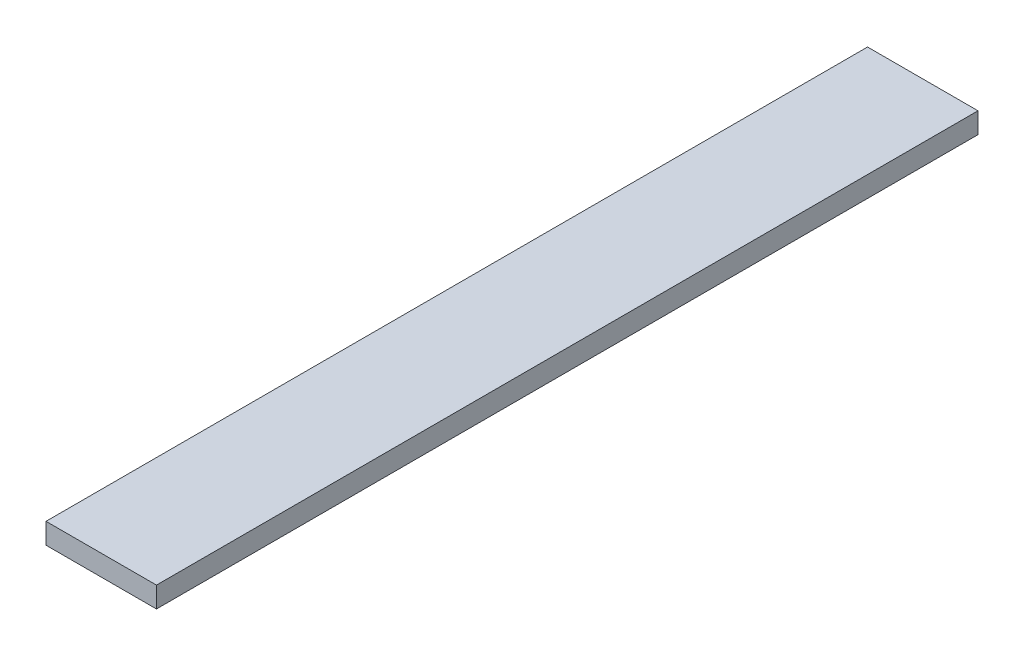
ISO-10303-21;
HEADER;
FILE_DESCRIPTION(('STEP AP214'),'2;1');
FILE_NAME('part.step','',(''),(''),'','','');
FILE_SCHEMA(('AUTOMOTIVE_DESIGN { 1 0 10303 214 1 1 1 1 }'));
ENDSEC;
DATA;
#1=APPLICATION_CONTEXT('core data for automotive mechanical design processes');
#2=APPLICATION_PROTOCOL_DEFINITION('international standard','automotive_design',2000,#1);
#3=PRODUCT_CONTEXT('',#1,'mechanical');
#4=PRODUCT('Part','Part','',(#3));
#5=PRODUCT_RELATED_PRODUCT_CATEGORY('part','',(#4));
#6=PRODUCT_DEFINITION_FORMATION('','',#4);
#7=PRODUCT_DEFINITION_CONTEXT('part definition',#1,'design');
#8=PRODUCT_DEFINITION('design','',#6,#7);
#9=PRODUCT_DEFINITION_SHAPE('','',#8);
#10=(LENGTH_UNIT() NAMED_UNIT(*) SI_UNIT(.MILLI.,.METRE.));
#11=(NAMED_UNIT(*) PLANE_ANGLE_UNIT() SI_UNIT($,.RADIAN.));
#12=(NAMED_UNIT(*) SI_UNIT($,.STERADIAN.) SOLID_ANGLE_UNIT());
#13=UNCERTAINTY_MEASURE_WITH_UNIT(LENGTH_MEASURE(1.E-05),#10,'distance_accuracy_value','');
#14=(GEOMETRIC_REPRESENTATION_CONTEXT(3) GLOBAL_UNCERTAINTY_ASSIGNED_CONTEXT((#13)) GLOBAL_UNIT_ASSIGNED_CONTEXT((#10,
#11,#12)) REPRESENTATION_CONTEXT('',''));
#15=CARTESIAN_POINT('',(0.,0.,0.));
#16=DIRECTION('',(0.,0.,1.));
#17=DIRECTION('',(1.,0.,0.));
#18=AXIS2_PLACEMENT_3D('',#15,#16,#17);
#19=CARTESIAN_POINT('',(-117.017974572793,19.05,72.5353247966424));
#20=DIRECTION('',(-1.,0.,0.));
#21=DIRECTION('',(0.,0.,1.));
#22=AXIS2_PLACEMENT_3D('',#19,#20,#21);
#23=PLANE('',#22);
#24=DIRECTION('',(0.,0.,-1.));
#25=VECTOR('',#24,1.);
#26=CARTESIAN_POINT('',(-117.017974572793,0.,72.5353247966424));
#27=LINE('',#26,#25);
#28=CARTESIAN_POINT('',(-117.017974572793,0.,828.185324796642));
#29=VERTEX_POINT('',#28);
#30=CARTESIAN_POINT('',(-117.017974572793,0.,72.5353247966424));
#31=VERTEX_POINT('',#30);
#32=EDGE_CURVE('E104',#29,#31,#27,.T.);
#33=ORIENTED_EDGE('',*,*,#32,.T.);
#34=DIRECTION('',(0.,-1.,0.));
#35=VECTOR('',#34,1.);
#36=CARTESIAN_POINT('',(-117.017974572793,19.05,72.5353247966424));
#37=LINE('',#36,#35);
#38=CARTESIAN_POINT('',(-117.017974572793,19.05,72.5353247966424));
#39=VERTEX_POINT('',#38);
#40=EDGE_CURVE('E11',#39,#31,#37,.T.);
#41=ORIENTED_EDGE('',*,*,#40,.F.);
#42=DIRECTION('',(0.,0.,-1.));
#43=VECTOR('',#42,1.);
#44=CARTESIAN_POINT('',(-117.017974572793,19.05,72.5353247966424));
#45=LINE('',#44,#43);
#46=CARTESIAN_POINT('',(-117.017974572793,19.05,828.185324796642));
#47=VERTEX_POINT('',#46);
#48=EDGE_CURVE('E86',#47,#39,#45,.T.);
#49=ORIENTED_EDGE('',*,*,#48,.F.);
#50=DIRECTION('',(0.,-1.,0.));
#51=VECTOR('',#50,1.);
#52=CARTESIAN_POINT('',(-117.017974572793,19.05,828.185324796642));
#53=LINE('',#52,#51);
#54=EDGE_CURVE('E100',#47,#29,#53,.T.);
#55=ORIENTED_EDGE('',*,*,#54,.T.);
#56=EDGE_LOOP('',(#33,#41,#49,#55));
#57=FACE_BOUND('',#56,.T.);
#58=ADVANCED_FACE('F34',(#57),#23,.F.);
#59=CARTESIAN_POINT('',(-117.017974572793,19.05,72.5353247966424));
#60=DIRECTION('',(0.,0.,1.));
#61=DIRECTION('',(1.,0.,0.));
#62=AXIS2_PLACEMENT_3D('',#59,#60,#61);
#63=PLANE('',#62);
#64=DIRECTION('',(-1.,0.,0.));
#65=VECTOR('',#64,1.);
#66=CARTESIAN_POINT('',(-117.017974572793,0.,72.5353247966424));
#67=LINE('',#66,#65);
#68=CARTESIAN_POINT('',(-218.617974572793,0.,72.5353247966424));
#69=VERTEX_POINT('',#68);
#70=EDGE_CURVE('E91',#31,#69,#67,.T.);
#71=ORIENTED_EDGE('',*,*,#70,.T.);
#72=DIRECTION('',(0.,-1.,0.));
#73=VECTOR('',#72,1.);
#74=CARTESIAN_POINT('',(-218.617974572793,19.05,72.5353247966424));
#75=LINE('',#74,#73);
#76=CARTESIAN_POINT('',(-218.617974572793,19.05,72.5353247966424));
#77=VERTEX_POINT('',#76);
#78=EDGE_CURVE('E43',#77,#69,#75,.T.);
#79=ORIENTED_EDGE('',*,*,#78,.F.);
#80=DIRECTION('',(-1.,0.,0.));
#81=VECTOR('',#80,1.);
#82=CARTESIAN_POINT('',(-117.017974572793,19.05,72.5353247966424));
#83=LINE('',#82,#81);
#84=EDGE_CURVE('E81',#39,#77,#83,.T.);
#85=ORIENTED_EDGE('',*,*,#84,.F.);
#86=ORIENTED_EDGE('',*,*,#40,.T.);
#87=EDGE_LOOP('',(#71,#79,#85,#86));
#88=FACE_BOUND('',#87,.T.);
#89=ADVANCED_FACE('F90',(#88),#63,.F.);
#90=CARTESIAN_POINT('',(-218.617974572793,19.05,72.5353247966424));
#91=DIRECTION('',(1.,0.,0.));
#92=DIRECTION('',(0.,0.,-1.));
#93=AXIS2_PLACEMENT_3D('',#90,#91,#92);
#94=PLANE('',#93);
#95=DIRECTION('',(0.,0.,1.));
#96=VECTOR('',#95,1.);
#97=CARTESIAN_POINT('',(-218.617974572793,0.,72.5353247966424));
#98=LINE('',#97,#96);
#99=CARTESIAN_POINT('',(-218.617974572793,0.,828.185324796642));
#100=VERTEX_POINT('',#99);
#101=EDGE_CURVE('E68',#69,#100,#98,.T.);
#102=ORIENTED_EDGE('',*,*,#101,.T.);
#103=DIRECTION('',(0.,-1.,0.));
#104=VECTOR('',#103,1.);
#105=CARTESIAN_POINT('',(-218.617974572793,19.05,828.185324796642));
#106=LINE('',#105,#104);
#107=CARTESIAN_POINT('',(-218.617974572793,19.05,828.185324796642));
#108=VERTEX_POINT('',#107);
#109=EDGE_CURVE('E93',#108,#100,#106,.T.);
#110=ORIENTED_EDGE('',*,*,#109,.F.);
#111=DIRECTION('',(0.,0.,1.));
#112=VECTOR('',#111,1.);
#113=CARTESIAN_POINT('',(-218.617974572793,19.05,72.5353247966424));
#114=LINE('',#113,#112);
#115=EDGE_CURVE('E84',#77,#108,#114,.T.);
#116=ORIENTED_EDGE('',*,*,#115,.F.);
#117=ORIENTED_EDGE('',*,*,#78,.T.);
#118=EDGE_LOOP('',(#102,#110,#116,#117));
#119=FACE_BOUND('',#118,.T.);
#120=ADVANCED_FACE('F94',(#119),#94,.F.);
#121=CARTESIAN_POINT('',(-117.017974572793,19.05,828.185324796642));
#122=DIRECTION('',(0.,0.,-1.));
#123=DIRECTION('',(-1.,0.,0.));
#124=AXIS2_PLACEMENT_3D('',#121,#122,#123);
#125=PLANE('',#124);
#126=DIRECTION('',(1.,0.,0.));
#127=VECTOR('',#126,1.);
#128=CARTESIAN_POINT('',(-117.017974572793,0.,828.185324796642));
#129=LINE('',#128,#127);
#130=EDGE_CURVE('E74',#100,#29,#129,.T.);
#131=ORIENTED_EDGE('',*,*,#130,.T.);
#132=ORIENTED_EDGE('',*,*,#54,.F.);
#133=DIRECTION('',(1.,0.,0.));
#134=VECTOR('',#133,1.);
#135=CARTESIAN_POINT('',(-117.017974572793,19.05,828.185324796642));
#136=LINE('',#135,#134);
#137=EDGE_CURVE('E51',#108,#47,#136,.T.);
#138=ORIENTED_EDGE('',*,*,#137,.F.);
#139=ORIENTED_EDGE('',*,*,#109,.T.);
#140=EDGE_LOOP('',(#131,#132,#138,#139));
#141=FACE_BOUND('',#140,.T.);
#142=ADVANCED_FACE('F116',(#141),#125,.F.);
#143=CARTESIAN_POINT('',(0.,19.05,0.));
#144=DIRECTION('',(0.,-1.,0.));
#145=DIRECTION('',(0.,0.,-1.));
#146=AXIS2_PLACEMENT_3D('',#143,#144,#145);
#147=PLANE('',#146);
#148=ORIENTED_EDGE('',*,*,#48,.T.);
#149=ORIENTED_EDGE('',*,*,#84,.T.);
#150=ORIENTED_EDGE('',*,*,#115,.T.);
#151=ORIENTED_EDGE('',*,*,#137,.T.);
#152=EDGE_LOOP('',(#148,#149,#150,#151));
#153=FACE_BOUND('',#152,.T.);
#154=ADVANCED_FACE('F82',(#153),#147,.F.);
#155=CARTESIAN_POINT('',(0.,0.,0.));
#156=DIRECTION('',(0.,-1.,0.));
#157=DIRECTION('',(0.,0.,-1.));
#158=AXIS2_PLACEMENT_3D('',#155,#156,#157);
#159=PLANE('',#158);
#160=ORIENTED_EDGE('',*,*,#32,.F.);
#161=ORIENTED_EDGE('',*,*,#130,.F.);
#162=ORIENTED_EDGE('',*,*,#101,.F.);
#163=ORIENTED_EDGE('',*,*,#70,.F.);
#164=EDGE_LOOP('',(#160,#161,#162,#163));
#165=FACE_BOUND('',#164,.T.);
#166=ADVANCED_FACE('F119',(#165),#159,.T.);
#167=CLOSED_SHELL('',(#58,#89,#120,#142,#154,#166));
#168=MANIFOLD_SOLID_BREP('B2',#167);
#169=ADVANCED_BREP_SHAPE_REPRESENTATION('',(#18,#168),#14);
#170=SHAPE_DEFINITION_REPRESENTATION(#9,#169);
ENDSEC;
END-ISO-10303-21;
